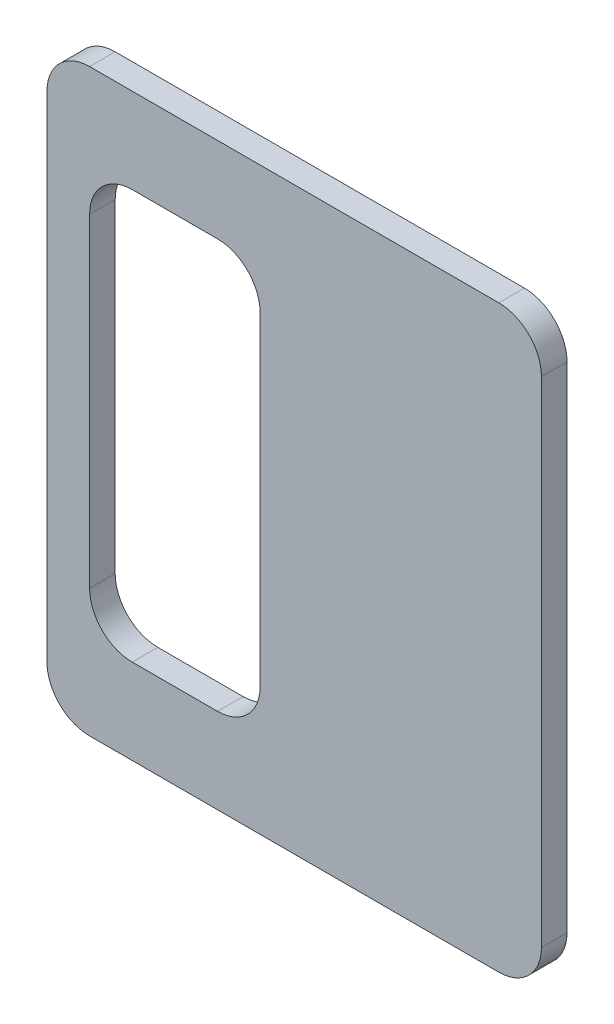
ISO-10303-21;
HEADER;
FILE_DESCRIPTION(('STEP AP214'),'2;1');
FILE_NAME('part.step','',(''),(''),'','','');
FILE_SCHEMA(('AUTOMOTIVE_DESIGN { 1 0 10303 214 1 1 1 1 }'));
ENDSEC;
DATA;
#1=APPLICATION_CONTEXT('core data for automotive mechanical design processes');
#2=APPLICATION_PROTOCOL_DEFINITION('international standard','automotive_design',2000,#1);
#3=PRODUCT_CONTEXT('',#1,'mechanical');
#4=PRODUCT('Part','Part','',(#3));
#5=PRODUCT_RELATED_PRODUCT_CATEGORY('part','',(#4));
#6=PRODUCT_DEFINITION_FORMATION('','',#4);
#7=PRODUCT_DEFINITION_CONTEXT('part definition',#1,'design');
#8=PRODUCT_DEFINITION('design','',#6,#7);
#9=PRODUCT_DEFINITION_SHAPE('','',#8);
#10=(LENGTH_UNIT() NAMED_UNIT(*) SI_UNIT(.MILLI.,.METRE.));
#11=(NAMED_UNIT(*) PLANE_ANGLE_UNIT() SI_UNIT($,.RADIAN.));
#12=(NAMED_UNIT(*) SI_UNIT($,.STERADIAN.) SOLID_ANGLE_UNIT());
#13=UNCERTAINTY_MEASURE_WITH_UNIT(LENGTH_MEASURE(1.E-05),#10,'distance_accuracy_value','');
#14=(GEOMETRIC_REPRESENTATION_CONTEXT(3) GLOBAL_UNCERTAINTY_ASSIGNED_CONTEXT((#13)) GLOBAL_UNIT_ASSIGNED_CONTEXT((#10,
#11,#12)) REPRESENTATION_CONTEXT('',''));
#15=CARTESIAN_POINT('',(0.,0.,0.));
#16=DIRECTION('',(0.,0.,1.));
#17=DIRECTION('',(1.,0.,0.));
#18=AXIS2_PLACEMENT_3D('',#15,#16,#17);
#19=CARTESIAN_POINT('',(0.,0.,3.));
#20=DIRECTION('',(0.,0.,-1.));
#21=DIRECTION('',(-1.,0.,0.));
#22=AXIS2_PLACEMENT_3D('',#19,#20,#21);
#23=PLANE('',#22);
#24=DIRECTION('',(0.,-1.,0.));
#25=VECTOR('',#24,1.);
#26=CARTESIAN_POINT('',(0.,0.,3.));
#27=LINE('',#26,#25);
#28=CARTESIAN_POINT('',(0.,63.,3.));
#29=VERTEX_POINT('',#28);
#30=CARTESIAN_POINT('',(0.,5.,3.));
#31=VERTEX_POINT('',#30);
#32=EDGE_CURVE('E192',#29,#31,#27,.T.);
#33=ORIENTED_EDGE('',*,*,#32,.T.);
#34=CARTESIAN_POINT('',(5.,5.,3.));
#35=DIRECTION('',(0.,0.,-1.));
#36=DIRECTION('',(-1.,0.,0.));
#37=AXIS2_PLACEMENT_3D('',#34,#35,#36);
#38=CIRCLE('',#37,5.);
#39=CARTESIAN_POINT('',(5.,0.,3.));
#40=VERTEX_POINT('',#39);
#41=EDGE_CURVE('E208',#31,#40,#38,.F.);
#42=ORIENTED_EDGE('',*,*,#41,.T.);
#43=DIRECTION('',(1.,0.,0.));
#44=VECTOR('',#43,1.);
#45=CARTESIAN_POINT('',(0.,0.,3.));
#46=LINE('',#45,#44);
#47=CARTESIAN_POINT('',(53.,0.,3.));
#48=VERTEX_POINT('',#47);
#49=EDGE_CURVE('E173',#40,#48,#46,.T.);
#50=ORIENTED_EDGE('',*,*,#49,.T.);
#51=CARTESIAN_POINT('',(53.,5.,3.));
#52=DIRECTION('',(0.,0.,-1.));
#53=DIRECTION('',(-1.,0.,0.));
#54=AXIS2_PLACEMENT_3D('',#51,#52,#53);
#55=CIRCLE('',#54,5.);
#56=CARTESIAN_POINT('',(58.,5.,3.));
#57=VERTEX_POINT('',#56);
#58=EDGE_CURVE('E202',#48,#57,#55,.F.);
#59=ORIENTED_EDGE('',*,*,#58,.T.);
#60=DIRECTION('',(0.,1.,0.));
#61=VECTOR('',#60,1.);
#62=CARTESIAN_POINT('',(58.,0.,3.));
#63=LINE('',#62,#61);
#64=CARTESIAN_POINT('',(58.,63.,3.));
#65=VERTEX_POINT('',#64);
#66=EDGE_CURVE('E285',#57,#65,#63,.T.);
#67=ORIENTED_EDGE('',*,*,#66,.T.);
#68=CARTESIAN_POINT('',(53.,63.,3.));
#69=DIRECTION('',(0.,0.,-1.));
#70=DIRECTION('',(-1.,0.,0.));
#71=AXIS2_PLACEMENT_3D('',#68,#69,#70);
#72=CIRCLE('',#71,5.);
#73=CARTESIAN_POINT('',(53.,68.,3.));
#74=VERTEX_POINT('',#73);
#75=EDGE_CURVE('E204',#65,#74,#72,.F.);
#76=ORIENTED_EDGE('',*,*,#75,.T.);
#77=DIRECTION('',(-1.,0.,0.));
#78=VECTOR('',#77,1.);
#79=CARTESIAN_POINT('',(0.,68.,3.));
#80=LINE('',#79,#78);
#81=CARTESIAN_POINT('',(5.,68.,3.));
#82=VERTEX_POINT('',#81);
#83=EDGE_CURVE('E193',#74,#82,#80,.T.);
#84=ORIENTED_EDGE('',*,*,#83,.T.);
#85=CARTESIAN_POINT('',(5.,63.,3.));
#86=DIRECTION('',(0.,0.,-1.));
#87=DIRECTION('',(-1.,0.,0.));
#88=AXIS2_PLACEMENT_3D('',#85,#86,#87);
#89=CIRCLE('',#88,5.);
#90=EDGE_CURVE('E206',#82,#29,#89,.F.);
#91=ORIENTED_EDGE('',*,*,#90,.T.);
#92=EDGE_LOOP('',(#33,#42,#50,#59,#67,#76,#84,#91));
#93=FACE_BOUND('',#92,.T.);
#94=DIRECTION('',(0.,-1.,0.));
#95=VECTOR('',#94,1.);
#96=CARTESIAN_POINT('',(5.,58.,3.));
#97=LINE('',#96,#95);
#98=CARTESIAN_POINT('',(5.,53.,3.));
#99=VERTEX_POINT('',#98);
#100=CARTESIAN_POINT('',(5.00000000000001,15.,3.));
#101=VERTEX_POINT('',#100);
#102=EDGE_CURVE('E258',#99,#101,#97,.T.);
#103=ORIENTED_EDGE('',*,*,#102,.F.);
#104=CARTESIAN_POINT('',(10.,53.,3.));
#105=DIRECTION('',(0.,0.,-1.));
#106=DIRECTION('',(-1.,0.,0.));
#107=AXIS2_PLACEMENT_3D('',#104,#105,#106);
#108=CIRCLE('',#107,5.);
#109=CARTESIAN_POINT('',(10.,58.,3.));
#110=VERTEX_POINT('',#109);
#111=EDGE_CURVE('E54',#99,#110,#108,.T.);
#112=ORIENTED_EDGE('',*,*,#111,.T.);
#113=DIRECTION('',(-1.,0.,0.));
#114=VECTOR('',#113,1.);
#115=CARTESIAN_POINT('',(5.,58.,3.));
#116=LINE('',#115,#114);
#117=CARTESIAN_POINT('',(20.,58.,3.));
#118=VERTEX_POINT('',#117);
#119=EDGE_CURVE('E186',#118,#110,#116,.T.);
#120=ORIENTED_EDGE('',*,*,#119,.F.);
#121=CARTESIAN_POINT('',(20.,53.,3.));
#122=DIRECTION('',(0.,0.,-1.));
#123=DIRECTION('',(-1.,0.,0.));
#124=AXIS2_PLACEMENT_3D('',#121,#122,#123);
#125=CIRCLE('',#124,5.);
#126=CARTESIAN_POINT('',(25.,53.,3.));
#127=VERTEX_POINT('',#126);
#128=EDGE_CURVE('E11',#118,#127,#125,.T.);
#129=ORIENTED_EDGE('',*,*,#128,.T.);
#130=DIRECTION('',(0.,1.,0.));
#131=VECTOR('',#130,1.);
#132=CARTESIAN_POINT('',(25.,58.,3.));
#133=LINE('',#132,#131);
#134=CARTESIAN_POINT('',(25.,15.,3.));
#135=VERTEX_POINT('',#134);
#136=EDGE_CURVE('E263',#135,#127,#133,.T.);
#137=ORIENTED_EDGE('',*,*,#136,.F.);
#138=CARTESIAN_POINT('',(20.,15.,3.));
#139=DIRECTION('',(0.,0.,-1.));
#140=DIRECTION('',(-1.,0.,0.));
#141=AXIS2_PLACEMENT_3D('',#138,#139,#140);
#142=CIRCLE('',#141,5.);
#143=CARTESIAN_POINT('',(20.,10.,3.));
#144=VERTEX_POINT('',#143);
#145=EDGE_CURVE('E241',#135,#144,#142,.T.);
#146=ORIENTED_EDGE('',*,*,#145,.T.);
#147=DIRECTION('',(1.,0.,0.));
#148=VECTOR('',#147,1.);
#149=CARTESIAN_POINT('',(5.00000000000001,10.,3.));
#150=LINE('',#149,#148);
#151=CARTESIAN_POINT('',(10.,10.,3.));
#152=VERTEX_POINT('',#151);
#153=EDGE_CURVE('E268',#152,#144,#150,.T.);
#154=ORIENTED_EDGE('',*,*,#153,.F.);
#155=CARTESIAN_POINT('',(10.,15.,3.));
#156=DIRECTION('',(0.,0.,-1.));
#157=DIRECTION('',(-1.,0.,0.));
#158=AXIS2_PLACEMENT_3D('',#155,#156,#157);
#159=CIRCLE('',#158,5.);
#160=EDGE_CURVE('E245',#152,#101,#159,.T.);
#161=ORIENTED_EDGE('',*,*,#160,.T.);
#162=EDGE_LOOP('',(#103,#112,#120,#129,#137,#146,#154,#161));
#163=FACE_BOUND('',#162,.T.);
#164=ADVANCED_FACE('F39',(#93,#163),#23,.F.);
#165=CARTESIAN_POINT('',(0.,0.,0.));
#166=DIRECTION('',(0.,0.,-1.));
#167=DIRECTION('',(-1.,0.,0.));
#168=AXIS2_PLACEMENT_3D('',#165,#166,#167);
#169=PLANE('',#168);
#170=DIRECTION('',(1.,0.,0.));
#171=VECTOR('',#170,1.);
#172=CARTESIAN_POINT('',(0.,0.,0.));
#173=LINE('',#172,#171);
#174=CARTESIAN_POINT('',(5.,0.,0.));
#175=VERTEX_POINT('',#174);
#176=CARTESIAN_POINT('',(53.,0.,0.));
#177=VERTEX_POINT('',#176);
#178=EDGE_CURVE('E170',#175,#177,#173,.T.);
#179=ORIENTED_EDGE('',*,*,#178,.F.);
#180=CARTESIAN_POINT('',(5.,5.,0.));
#181=DIRECTION('',(0.,0.,-1.));
#182=DIRECTION('',(-1.,0.,0.));
#183=AXIS2_PLACEMENT_3D('',#180,#181,#182);
#184=CIRCLE('',#183,5.);
#185=CARTESIAN_POINT('',(0.,5.,0.));
#186=VERTEX_POINT('',#185);
#187=EDGE_CURVE('E153',#175,#186,#184,.T.);
#188=ORIENTED_EDGE('',*,*,#187,.T.);
#189=DIRECTION('',(0.,-1.,0.));
#190=VECTOR('',#189,1.);
#191=CARTESIAN_POINT('',(0.,0.,0.));
#192=LINE('',#191,#190);
#193=CARTESIAN_POINT('',(0.,63.,0.));
#194=VERTEX_POINT('',#193);
#195=EDGE_CURVE('E181',#194,#186,#192,.T.);
#196=ORIENTED_EDGE('',*,*,#195,.F.);
#197=CARTESIAN_POINT('',(5.,63.,0.));
#198=DIRECTION('',(0.,0.,-1.));
#199=DIRECTION('',(-1.,0.,0.));
#200=AXIS2_PLACEMENT_3D('',#197,#198,#199);
#201=CIRCLE('',#200,5.);
#202=CARTESIAN_POINT('',(5.,68.,0.));
#203=VERTEX_POINT('',#202);
#204=EDGE_CURVE('E164',#194,#203,#201,.T.);
#205=ORIENTED_EDGE('',*,*,#204,.T.);
#206=DIRECTION('',(-1.,0.,0.));
#207=VECTOR('',#206,1.);
#208=CARTESIAN_POINT('',(0.,68.,0.));
#209=LINE('',#208,#207);
#210=CARTESIAN_POINT('',(53.,68.,0.));
#211=VERTEX_POINT('',#210);
#212=EDGE_CURVE('E184',#211,#203,#209,.T.);
#213=ORIENTED_EDGE('',*,*,#212,.F.);
#214=CARTESIAN_POINT('',(53.,63.,0.));
#215=DIRECTION('',(0.,0.,-1.));
#216=DIRECTION('',(-1.,0.,0.));
#217=AXIS2_PLACEMENT_3D('',#214,#215,#216);
#218=CIRCLE('',#217,5.);
#219=CARTESIAN_POINT('',(58.,63.,0.));
#220=VERTEX_POINT('',#219);
#221=EDGE_CURVE('E196',#211,#220,#218,.T.);
#222=ORIENTED_EDGE('',*,*,#221,.T.);
#223=DIRECTION('',(0.,1.,0.));
#224=VECTOR('',#223,1.);
#225=CARTESIAN_POINT('',(58.,0.,0.));
#226=LINE('',#225,#224);
#227=CARTESIAN_POINT('',(58.,5.,0.));
#228=VERTEX_POINT('',#227);
#229=EDGE_CURVE('E180',#228,#220,#226,.T.);
#230=ORIENTED_EDGE('',*,*,#229,.F.);
#231=CARTESIAN_POINT('',(53.,5.,0.));
#232=DIRECTION('',(0.,0.,-1.));
#233=DIRECTION('',(-1.,0.,0.));
#234=AXIS2_PLACEMENT_3D('',#231,#232,#233);
#235=CIRCLE('',#234,5.);
#236=EDGE_CURVE('E174',#228,#177,#235,.T.);
#237=ORIENTED_EDGE('',*,*,#236,.T.);
#238=EDGE_LOOP('',(#179,#188,#196,#205,#213,#222,#230,#237));
#239=FACE_BOUND('',#238,.T.);
#240=DIRECTION('',(0.,1.,0.));
#241=VECTOR('',#240,1.);
#242=CARTESIAN_POINT('',(25.,58.,0.));
#243=LINE('',#242,#241);
#244=CARTESIAN_POINT('',(25.,15.,0.));
#245=VERTEX_POINT('',#244);
#246=CARTESIAN_POINT('',(25.,53.,0.));
#247=VERTEX_POINT('',#246);
#248=EDGE_CURVE('E253',#245,#247,#243,.T.);
#249=ORIENTED_EDGE('',*,*,#248,.T.);
#250=CARTESIAN_POINT('',(20.,53.,0.));
#251=DIRECTION('',(0.,0.,-1.));
#252=DIRECTION('',(-1.,0.,0.));
#253=AXIS2_PLACEMENT_3D('',#250,#251,#252);
#254=CIRCLE('',#253,5.);
#255=CARTESIAN_POINT('',(20.,58.,0.));
#256=VERTEX_POINT('',#255);
#257=EDGE_CURVE('E47',#247,#256,#254,.F.);
#258=ORIENTED_EDGE('',*,*,#257,.T.);
#259=DIRECTION('',(-1.,0.,0.));
#260=VECTOR('',#259,1.);
#261=CARTESIAN_POINT('',(5.,58.,0.));
#262=LINE('',#261,#260);
#263=CARTESIAN_POINT('',(10.,58.,0.));
#264=VERTEX_POINT('',#263);
#265=EDGE_CURVE('E251',#256,#264,#262,.T.);
#266=ORIENTED_EDGE('',*,*,#265,.T.);
#267=CARTESIAN_POINT('',(10.,53.,0.));
#268=DIRECTION('',(0.,0.,-1.));
#269=DIRECTION('',(-1.,0.,0.));
#270=AXIS2_PLACEMENT_3D('',#267,#268,#269);
#271=CIRCLE('',#270,5.);
#272=CARTESIAN_POINT('',(5.,53.,0.));
#273=VERTEX_POINT('',#272);
#274=EDGE_CURVE('E247',#264,#273,#271,.F.);
#275=ORIENTED_EDGE('',*,*,#274,.T.);
#276=DIRECTION('',(0.,-1.,0.));
#277=VECTOR('',#276,1.);
#278=CARTESIAN_POINT('',(5.,58.,0.));
#279=LINE('',#278,#277);
#280=CARTESIAN_POINT('',(5.00000000000001,15.,0.));
#281=VERTEX_POINT('',#280);
#282=EDGE_CURVE('E275',#273,#281,#279,.T.);
#283=ORIENTED_EDGE('',*,*,#282,.T.);
#284=CARTESIAN_POINT('',(10.,15.,0.));
#285=DIRECTION('',(0.,0.,-1.));
#286=DIRECTION('',(-1.,0.,0.));
#287=AXIS2_PLACEMENT_3D('',#284,#285,#286);
#288=CIRCLE('',#287,5.);
#289=CARTESIAN_POINT('',(10.,10.,0.));
#290=VERTEX_POINT('',#289);
#291=EDGE_CURVE('E243',#281,#290,#288,.F.);
#292=ORIENTED_EDGE('',*,*,#291,.T.);
#293=DIRECTION('',(1.,0.,0.));
#294=VECTOR('',#293,1.);
#295=CARTESIAN_POINT('',(5.00000000000001,10.,0.));
#296=LINE('',#295,#294);
#297=CARTESIAN_POINT('',(20.,10.,0.));
#298=VERTEX_POINT('',#297);
#299=EDGE_CURVE('E278',#290,#298,#296,.T.);
#300=ORIENTED_EDGE('',*,*,#299,.T.);
#301=CARTESIAN_POINT('',(20.,15.,0.));
#302=DIRECTION('',(0.,0.,-1.));
#303=DIRECTION('',(-1.,0.,0.));
#304=AXIS2_PLACEMENT_3D('',#301,#302,#303);
#305=CIRCLE('',#304,5.);
#306=EDGE_CURVE('E239',#298,#245,#305,.F.);
#307=ORIENTED_EDGE('',*,*,#306,.T.);
#308=EDGE_LOOP('',(#249,#258,#266,#275,#283,#292,#300,#307));
#309=FACE_BOUND('',#308,.T.);
#310=ADVANCED_FACE('F177',(#239,#309),#169,.T.);
#311=CARTESIAN_POINT('',(0.,0.,3.));
#312=DIRECTION('',(1.,0.,0.));
#313=DIRECTION('',(0.,0.,-1.));
#314=AXIS2_PLACEMENT_3D('',#311,#312,#313);
#315=PLANE('',#314);
#316=ORIENTED_EDGE('',*,*,#195,.T.);
#317=DIRECTION('',(0.,0.,-1.));
#318=VECTOR('',#317,1.);
#319=CARTESIAN_POINT('',(0.,5.,3.));
#320=LINE('',#319,#318);
#321=EDGE_CURVE('E158',#186,#31,#320,.F.);
#322=ORIENTED_EDGE('',*,*,#321,.T.);
#323=ORIENTED_EDGE('',*,*,#32,.F.);
#324=DIRECTION('',(0.,0.,-1.));
#325=VECTOR('',#324,1.);
#326=CARTESIAN_POINT('',(0.,63.,3.));
#327=LINE('',#326,#325);
#328=EDGE_CURVE('E163',#29,#194,#327,.T.);
#329=ORIENTED_EDGE('',*,*,#328,.T.);
#330=EDGE_LOOP('',(#316,#322,#323,#329));
#331=FACE_BOUND('',#330,.T.);
#332=ADVANCED_FACE('F300',(#331),#315,.F.);
#333=CARTESIAN_POINT('',(0.,0.,3.));
#334=DIRECTION('',(0.,1.,0.));
#335=DIRECTION('',(0.,0.,1.));
#336=AXIS2_PLACEMENT_3D('',#333,#334,#335);
#337=PLANE('',#336);
#338=ORIENTED_EDGE('',*,*,#49,.F.);
#339=DIRECTION('',(0.,0.,-1.));
#340=VECTOR('',#339,1.);
#341=CARTESIAN_POINT('',(5.,0.,3.));
#342=LINE('',#341,#340);
#343=EDGE_CURVE('E157',#40,#175,#342,.T.);
#344=ORIENTED_EDGE('',*,*,#343,.T.);
#345=ORIENTED_EDGE('',*,*,#178,.T.);
#346=DIRECTION('',(0.,0.,-1.));
#347=VECTOR('',#346,1.);
#348=CARTESIAN_POINT('',(53.,0.,3.));
#349=LINE('',#348,#347);
#350=EDGE_CURVE('E175',#177,#48,#349,.F.);
#351=ORIENTED_EDGE('',*,*,#350,.T.);
#352=EDGE_LOOP('',(#338,#344,#345,#351));
#353=FACE_BOUND('',#352,.T.);
#354=ADVANCED_FACE('F169',(#353),#337,.F.);
#355=CARTESIAN_POINT('',(58.,0.,3.));
#356=DIRECTION('',(-1.,0.,0.));
#357=DIRECTION('',(0.,0.,1.));
#358=AXIS2_PLACEMENT_3D('',#355,#356,#357);
#359=PLANE('',#358);
#360=ORIENTED_EDGE('',*,*,#229,.T.);
#361=DIRECTION('',(0.,0.,-1.));
#362=VECTOR('',#361,1.);
#363=CARTESIAN_POINT('',(58.,63.,3.));
#364=LINE('',#363,#362);
#365=EDGE_CURVE('E218',#220,#65,#364,.F.);
#366=ORIENTED_EDGE('',*,*,#365,.T.);
#367=ORIENTED_EDGE('',*,*,#66,.F.);
#368=DIRECTION('',(0.,0.,-1.));
#369=VECTOR('',#368,1.);
#370=CARTESIAN_POINT('',(58.,5.,3.));
#371=LINE('',#370,#369);
#372=EDGE_CURVE('E215',#57,#228,#371,.T.);
#373=ORIENTED_EDGE('',*,*,#372,.T.);
#374=EDGE_LOOP('',(#360,#366,#367,#373));
#375=FACE_BOUND('',#374,.T.);
#376=ADVANCED_FACE('F307',(#375),#359,.F.);
#377=CARTESIAN_POINT('',(0.,68.,3.));
#378=DIRECTION('',(0.,-1.,0.));
#379=DIRECTION('',(0.,0.,-1.));
#380=AXIS2_PLACEMENT_3D('',#377,#378,#379);
#381=PLANE('',#380);
#382=ORIENTED_EDGE('',*,*,#212,.T.);
#383=DIRECTION('',(0.,0.,-1.));
#384=VECTOR('',#383,1.);
#385=CARTESIAN_POINT('',(5.,68.,3.));
#386=LINE('',#385,#384);
#387=EDGE_CURVE('E213',#203,#82,#386,.F.);
#388=ORIENTED_EDGE('',*,*,#387,.T.);
#389=ORIENTED_EDGE('',*,*,#83,.F.);
#390=DIRECTION('',(0.,0.,-1.));
#391=VECTOR('',#390,1.);
#392=CARTESIAN_POINT('',(53.,68.,3.));
#393=LINE('',#392,#391);
#394=EDGE_CURVE('E210',#74,#211,#393,.T.);
#395=ORIENTED_EDGE('',*,*,#394,.T.);
#396=EDGE_LOOP('',(#382,#388,#389,#395));
#397=FACE_BOUND('',#396,.T.);
#398=ADVANCED_FACE('F302',(#397),#381,.F.);
#399=CARTESIAN_POINT('',(5.,58.,3.));
#400=DIRECTION('',(1.,0.,0.));
#401=DIRECTION('',(0.,1.,0.));
#402=AXIS2_PLACEMENT_3D('',#399,#400,#401);
#403=PLANE('',#402);
#404=ORIENTED_EDGE('',*,*,#102,.T.);
#405=DIRECTION('',(0.,0.,-1.));
#406=VECTOR('',#405,1.);
#407=CARTESIAN_POINT('',(5.00000000000001,15.,0.));
#408=LINE('',#407,#406);
#409=EDGE_CURVE('E232',#101,#281,#408,.T.);
#410=ORIENTED_EDGE('',*,*,#409,.T.);
#411=ORIENTED_EDGE('',*,*,#282,.F.);
#412=DIRECTION('',(0.,0.,-1.));
#413=VECTOR('',#412,1.);
#414=CARTESIAN_POINT('',(5.,53.,3.));
#415=LINE('',#414,#413);
#416=EDGE_CURVE('E230',#273,#99,#415,.F.);
#417=ORIENTED_EDGE('',*,*,#416,.T.);
#418=EDGE_LOOP('',(#404,#410,#411,#417));
#419=FACE_BOUND('',#418,.T.);
#420=ADVANCED_FACE('F331',(#419),#403,.T.);
#421=CARTESIAN_POINT('',(5.00000000000001,10.,3.));
#422=DIRECTION('',(0.,1.,0.));
#423=DIRECTION('',(0.,0.,1.));
#424=AXIS2_PLACEMENT_3D('',#421,#422,#423);
#425=PLANE('',#424);
#426=ORIENTED_EDGE('',*,*,#153,.T.);
#427=DIRECTION('',(0.,0.,-1.));
#428=VECTOR('',#427,1.);
#429=CARTESIAN_POINT('',(20.,10.,0.));
#430=LINE('',#429,#428);
#431=EDGE_CURVE('E222',#144,#298,#430,.T.);
#432=ORIENTED_EDGE('',*,*,#431,.T.);
#433=ORIENTED_EDGE('',*,*,#299,.F.);
#434=DIRECTION('',(0.,0.,-1.));
#435=VECTOR('',#434,1.);
#436=CARTESIAN_POINT('',(10.,10.,3.));
#437=LINE('',#436,#435);
#438=EDGE_CURVE('E220',#290,#152,#437,.F.);
#439=ORIENTED_EDGE('',*,*,#438,.T.);
#440=EDGE_LOOP('',(#426,#432,#433,#439));
#441=FACE_BOUND('',#440,.T.);
#442=ADVANCED_FACE('F403',(#441),#425,.T.);
#443=CARTESIAN_POINT('',(25.,58.,3.));
#444=DIRECTION('',(-1.,0.,0.));
#445=DIRECTION('',(0.,-1.,0.));
#446=AXIS2_PLACEMENT_3D('',#443,#444,#445);
#447=PLANE('',#446);
#448=ORIENTED_EDGE('',*,*,#248,.F.);
#449=DIRECTION('',(0.,0.,-1.));
#450=VECTOR('',#449,1.);
#451=CARTESIAN_POINT('',(25.,15.,3.));
#452=LINE('',#451,#450);
#453=EDGE_CURVE('E228',#245,#135,#452,.F.);
#454=ORIENTED_EDGE('',*,*,#453,.T.);
#455=ORIENTED_EDGE('',*,*,#136,.T.);
#456=DIRECTION('',(0.,0.,-1.));
#457=VECTOR('',#456,1.);
#458=CARTESIAN_POINT('',(25.,53.,0.));
#459=LINE('',#458,#457);
#460=EDGE_CURVE('E225',#127,#247,#459,.T.);
#461=ORIENTED_EDGE('',*,*,#460,.T.);
#462=EDGE_LOOP('',(#448,#454,#455,#461));
#463=FACE_BOUND('',#462,.T.);
#464=ADVANCED_FACE('F266',(#463),#447,.T.);
#465=CARTESIAN_POINT('',(5.,58.,3.));
#466=DIRECTION('',(0.,-1.,0.));
#467=DIRECTION('',(0.,0.,-1.));
#468=AXIS2_PLACEMENT_3D('',#465,#466,#467);
#469=PLANE('',#468);
#470=ORIENTED_EDGE('',*,*,#119,.T.);
#471=DIRECTION('',(0.,0.,-1.));
#472=VECTOR('',#471,1.);
#473=CARTESIAN_POINT('',(10.,58.,0.));
#474=LINE('',#473,#472);
#475=EDGE_CURVE('E236',#110,#264,#474,.T.);
#476=ORIENTED_EDGE('',*,*,#475,.T.);
#477=ORIENTED_EDGE('',*,*,#265,.F.);
#478=DIRECTION('',(0.,0.,-1.));
#479=VECTOR('',#478,1.);
#480=CARTESIAN_POINT('',(20.,58.,3.));
#481=LINE('',#480,#479);
#482=EDGE_CURVE('E61',#256,#118,#481,.F.);
#483=ORIENTED_EDGE('',*,*,#482,.T.);
#484=EDGE_LOOP('',(#470,#476,#477,#483));
#485=FACE_BOUND('',#484,.T.);
#486=ADVANCED_FACE('F256',(#485),#469,.T.);
#487=CARTESIAN_POINT('',(5.,5.,3.));
#488=DIRECTION('',(0.,0.,-1.));
#489=DIRECTION('',(-1.,0.,0.));
#490=AXIS2_PLACEMENT_3D('',#487,#488,#489);
#491=CYLINDRICAL_SURFACE('',#490,5.);
#492=ORIENTED_EDGE('',*,*,#41,.F.);
#493=ORIENTED_EDGE('',*,*,#321,.F.);
#494=ORIENTED_EDGE('',*,*,#187,.F.);
#495=ORIENTED_EDGE('',*,*,#343,.F.);
#496=EDGE_LOOP('',(#492,#493,#494,#495));
#497=FACE_BOUND('',#496,.T.);
#498=ADVANCED_FACE('F156',(#497),#491,.T.);
#499=CARTESIAN_POINT('',(5.,63.,3.));
#500=DIRECTION('',(0.,0.,-1.));
#501=DIRECTION('',(-1.,0.,0.));
#502=AXIS2_PLACEMENT_3D('',#499,#500,#501);
#503=CYLINDRICAL_SURFACE('',#502,5.);
#504=ORIENTED_EDGE('',*,*,#90,.F.);
#505=ORIENTED_EDGE('',*,*,#387,.F.);
#506=ORIENTED_EDGE('',*,*,#204,.F.);
#507=ORIENTED_EDGE('',*,*,#328,.F.);
#508=EDGE_LOOP('',(#504,#505,#506,#507));
#509=FACE_BOUND('',#508,.T.);
#510=ADVANCED_FACE('F298',(#509),#503,.T.);
#511=CARTESIAN_POINT('',(53.,63.,3.));
#512=DIRECTION('',(0.,0.,-1.));
#513=DIRECTION('',(-1.,0.,0.));
#514=AXIS2_PLACEMENT_3D('',#511,#512,#513);
#515=CYLINDRICAL_SURFACE('',#514,5.);
#516=ORIENTED_EDGE('',*,*,#75,.F.);
#517=ORIENTED_EDGE('',*,*,#365,.F.);
#518=ORIENTED_EDGE('',*,*,#221,.F.);
#519=ORIENTED_EDGE('',*,*,#394,.F.);
#520=EDGE_LOOP('',(#516,#517,#518,#519));
#521=FACE_BOUND('',#520,.T.);
#522=ADVANCED_FACE('F304',(#521),#515,.T.);
#523=CARTESIAN_POINT('',(53.,5.,3.));
#524=DIRECTION('',(0.,0.,-1.));
#525=DIRECTION('',(-1.,0.,0.));
#526=AXIS2_PLACEMENT_3D('',#523,#524,#525);
#527=CYLINDRICAL_SURFACE('',#526,5.);
#528=ORIENTED_EDGE('',*,*,#58,.F.);
#529=ORIENTED_EDGE('',*,*,#350,.F.);
#530=ORIENTED_EDGE('',*,*,#236,.F.);
#531=ORIENTED_EDGE('',*,*,#372,.F.);
#532=EDGE_LOOP('',(#528,#529,#530,#531));
#533=FACE_BOUND('',#532,.T.);
#534=ADVANCED_FACE('F312',(#533),#527,.T.);
#535=CARTESIAN_POINT('',(20.,15.,3.));
#536=DIRECTION('',(0.,0.,1.));
#537=DIRECTION('',(1.,0.,0.));
#538=AXIS2_PLACEMENT_3D('',#535,#536,#537);
#539=CYLINDRICAL_SURFACE('',#538,5.);
#540=ORIENTED_EDGE('',*,*,#145,.F.);
#541=ORIENTED_EDGE('',*,*,#453,.F.);
#542=ORIENTED_EDGE('',*,*,#306,.F.);
#543=ORIENTED_EDGE('',*,*,#431,.F.);
#544=EDGE_LOOP('',(#540,#541,#542,#543));
#545=FACE_BOUND('',#544,.T.);
#546=ADVANCED_FACE('F314',(#545),#539,.F.);
#547=CARTESIAN_POINT('',(10.,15.,3.));
#548=DIRECTION('',(0.,0.,1.));
#549=DIRECTION('',(1.,0.,0.));
#550=AXIS2_PLACEMENT_3D('',#547,#548,#549);
#551=CYLINDRICAL_SURFACE('',#550,5.);
#552=ORIENTED_EDGE('',*,*,#160,.F.);
#553=ORIENTED_EDGE('',*,*,#438,.F.);
#554=ORIENTED_EDGE('',*,*,#291,.F.);
#555=ORIENTED_EDGE('',*,*,#409,.F.);
#556=EDGE_LOOP('',(#552,#553,#554,#555));
#557=FACE_BOUND('',#556,.T.);
#558=ADVANCED_FACE('F321',(#557),#551,.F.);
#559=CARTESIAN_POINT('',(10.,53.,3.));
#560=DIRECTION('',(0.,0.,1.));
#561=DIRECTION('',(1.,0.,0.));
#562=AXIS2_PLACEMENT_3D('',#559,#560,#561);
#563=CYLINDRICAL_SURFACE('',#562,5.);
#564=ORIENTED_EDGE('',*,*,#111,.F.);
#565=ORIENTED_EDGE('',*,*,#416,.F.);
#566=ORIENTED_EDGE('',*,*,#274,.F.);
#567=ORIENTED_EDGE('',*,*,#475,.F.);
#568=EDGE_LOOP('',(#564,#565,#566,#567));
#569=FACE_BOUND('',#568,.T.);
#570=ADVANCED_FACE('F375',(#569),#563,.F.);
#571=CARTESIAN_POINT('',(20.,53.,3.));
#572=DIRECTION('',(0.,0.,1.));
#573=DIRECTION('',(1.,0.,0.));
#574=AXIS2_PLACEMENT_3D('',#571,#572,#573);
#575=CYLINDRICAL_SURFACE('',#574,5.);
#576=ORIENTED_EDGE('',*,*,#128,.F.);
#577=ORIENTED_EDGE('',*,*,#482,.F.);
#578=ORIENTED_EDGE('',*,*,#257,.F.);
#579=ORIENTED_EDGE('',*,*,#460,.F.);
#580=EDGE_LOOP('',(#576,#577,#578,#579));
#581=FACE_BOUND('',#580,.T.);
#582=ADVANCED_FACE('F41',(#581),#575,.F.);
#583=CLOSED_SHELL('',(#164,#310,#332,#354,#376,#398,#420,#442,#464,#486,#498,#510,#522,#534,
#546,#558,#570,#582));
#584=MANIFOLD_SOLID_BREP('B2',#583);
#585=ADVANCED_BREP_SHAPE_REPRESENTATION('',(#18,#584),#14);
#586=SHAPE_DEFINITION_REPRESENTATION(#9,#585);
ENDSEC;
END-ISO-10303-21;
